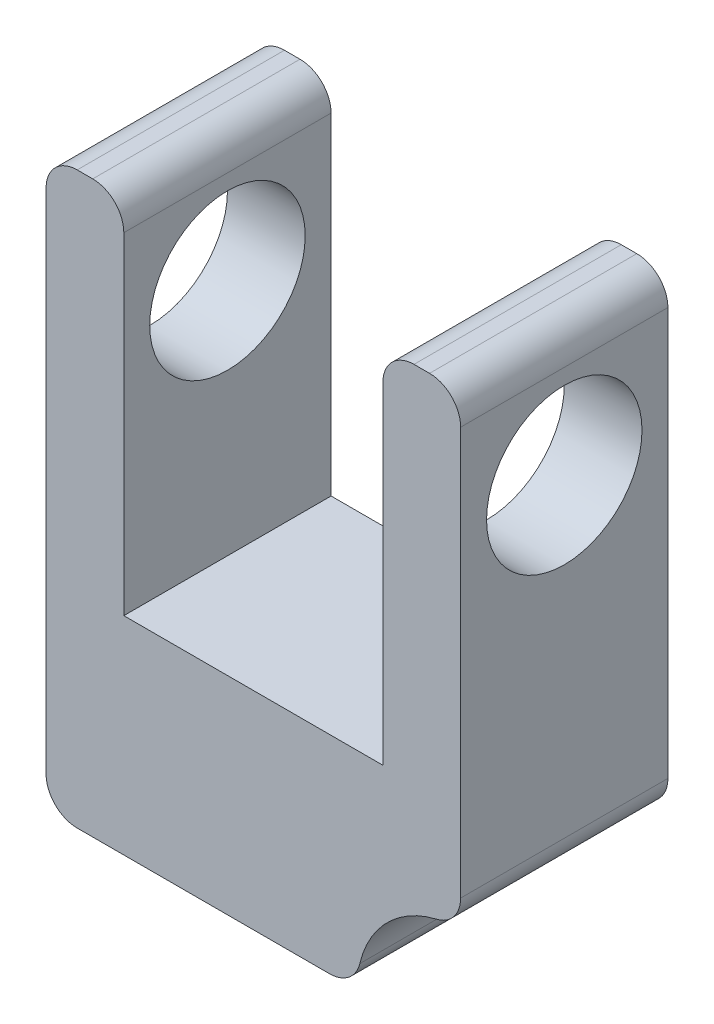
ISO-10303-21;
HEADER;
FILE_DESCRIPTION(('STEP AP214'),'2;1');
FILE_NAME('part.step','',(''),(''),'','','');
FILE_SCHEMA(('AUTOMOTIVE_DESIGN { 1 0 10303 214 1 1 1 1 }'));
ENDSEC;
DATA;
#1=APPLICATION_CONTEXT('core data for automotive mechanical design processes');
#2=APPLICATION_PROTOCOL_DEFINITION('international standard','automotive_design',2000,#1);
#3=PRODUCT_CONTEXT('',#1,'mechanical');
#4=PRODUCT('Part','Part','',(#3));
#5=PRODUCT_RELATED_PRODUCT_CATEGORY('part','',(#4));
#6=PRODUCT_DEFINITION_FORMATION('','',#4);
#7=PRODUCT_DEFINITION_CONTEXT('part definition',#1,'design');
#8=PRODUCT_DEFINITION('design','',#6,#7);
#9=PRODUCT_DEFINITION_SHAPE('','',#8);
#10=(LENGTH_UNIT() NAMED_UNIT(*) SI_UNIT(.MILLI.,.METRE.));
#11=(NAMED_UNIT(*) PLANE_ANGLE_UNIT() SI_UNIT($,.RADIAN.));
#12=(NAMED_UNIT(*) SI_UNIT($,.STERADIAN.) SOLID_ANGLE_UNIT());
#13=UNCERTAINTY_MEASURE_WITH_UNIT(LENGTH_MEASURE(1.E-05),#10,'distance_accuracy_value','');
#14=(GEOMETRIC_REPRESENTATION_CONTEXT(3) GLOBAL_UNCERTAINTY_ASSIGNED_CONTEXT((#13)) GLOBAL_UNIT_ASSIGNED_CONTEXT((#10,
#11,#12)) REPRESENTATION_CONTEXT('',''));
#15=CARTESIAN_POINT('',(0.,0.,0.));
#16=DIRECTION('',(0.,0.,1.));
#17=DIRECTION('',(1.,0.,0.));
#18=AXIS2_PLACEMENT_3D('',#15,#16,#17);
#19=CARTESIAN_POINT('',(0.,55.,0.));
#20=DIRECTION('',(0.,1.,0.));
#21=DIRECTION('',(0.,0.,1.));
#22=AXIS2_PLACEMENT_3D('',#19,#20,#21);
#23=PLANE('',#22);
#24=DIRECTION('',(-1.,0.,0.));
#25=VECTOR('',#24,1.);
#26=CARTESIAN_POINT('',(20.,55.,-10.));
#27=LINE('',#26,#25);
#28=CARTESIAN_POINT('',(-15.5,55.,-10.));
#29=VERTEX_POINT('',#28);
#30=CARTESIAN_POINT('',(-17.,55.,-10.));
#31=VERTEX_POINT('',#30);
#32=EDGE_CURVE('E202',#29,#31,#27,.T.);
#33=ORIENTED_EDGE('',*,*,#32,.T.);
#34=DIRECTION('',(0.,0.,1.));
#35=VECTOR('',#34,1.);
#36=CARTESIAN_POINT('',(-17.,55.,10.));
#37=LINE('',#36,#35);
#38=CARTESIAN_POINT('',(-17.,55.,10.));
#39=VERTEX_POINT('',#38);
#40=EDGE_CURVE('E266',#31,#39,#37,.T.);
#41=ORIENTED_EDGE('',*,*,#40,.T.);
#42=DIRECTION('',(1.,0.,0.));
#43=VECTOR('',#42,1.);
#44=CARTESIAN_POINT('',(20.,55.,10.));
#45=LINE('',#44,#43);
#46=CARTESIAN_POINT('',(-15.5,55.,10.));
#47=VERTEX_POINT('',#46);
#48=EDGE_CURVE('E199',#39,#47,#45,.T.);
#49=ORIENTED_EDGE('',*,*,#48,.T.);
#50=DIRECTION('',(0.,0.,1.));
#51=VECTOR('',#50,1.);
#52=CARTESIAN_POINT('',(-15.5,55.,-10.));
#53=LINE('',#52,#51);
#54=EDGE_CURVE('E264',#47,#29,#53,.F.);
#55=ORIENTED_EDGE('',*,*,#54,.T.);
#56=EDGE_LOOP('',(#33,#41,#49,#55));
#57=FACE_BOUND('',#56,.T.);
#58=ADVANCED_FACE('F39',(#57),#23,.T.);
#59=CARTESIAN_POINT('',(-20.,43.,0.));
#60=DIRECTION('',(1.,0.,0.));
#61=DIRECTION('',(0.,0.,-1.));
#62=AXIS2_PLACEMENT_3D('',#59,#60,#61);
#63=CYLINDRICAL_SURFACE('',#62,7.49999999999999);
#64=CARTESIAN_POINT('',(-12.5,43.,0.));
#65=DIRECTION('',(-1.,0.,0.));
#66=DIRECTION('',(0.,0.,1.));
#67=AXIS2_PLACEMENT_3D('',#64,#65,#66);
#68=CIRCLE('',#67,7.49999999999999);
#69=CARTESIAN_POINT('',(-12.5,43.,7.49999999999999));
#70=VERTEX_POINT('',#69);
#71=EDGE_CURVE('E198',#70,#70,#68,.F.);
#72=ORIENTED_EDGE('',*,*,#71,.T.);
#73=EDGE_LOOP('',(#72));
#74=FACE_BOUND('',#73,.T.);
#75=CARTESIAN_POINT('',(-20.,43.,0.));
#76=DIRECTION('',(1.,0.,0.));
#77=DIRECTION('',(0.,0.,-1.));
#78=AXIS2_PLACEMENT_3D('',#75,#76,#77);
#79=CIRCLE('',#78,7.49999999999999);
#80=CARTESIAN_POINT('',(-20.,43.,-7.49999999999999));
#81=VERTEX_POINT('',#80);
#82=EDGE_CURVE('E191',#81,#81,#79,.T.);
#83=ORIENTED_EDGE('',*,*,#82,.F.);
#84=EDGE_LOOP('',(#83));
#85=FACE_BOUND('',#84,.T.);
#86=ADVANCED_FACE('F365',(#74,#85),#63,.F.);
#87=CARTESIAN_POINT('',(-20.,55.,10.));
#88=DIRECTION('',(1.,0.,0.));
#89=DIRECTION('',(0.,0.,-1.));
#90=AXIS2_PLACEMENT_3D('',#87,#88,#89);
#91=PLANE('',#90);
#92=ORIENTED_EDGE('',*,*,#82,.T.);
#93=EDGE_LOOP('',(#92));
#94=FACE_BOUND('',#93,.T.);
#95=DIRECTION('',(0.,-1.,0.));
#96=VECTOR('',#95,1.);
#97=CARTESIAN_POINT('',(-20.,55.,10.));
#98=LINE('',#97,#96);
#99=CARTESIAN_POINT('',(-20.,52.,10.));
#100=VERTEX_POINT('',#99);
#101=CARTESIAN_POINT('',(-20.,3.,10.));
#102=VERTEX_POINT('',#101);
#103=EDGE_CURVE('E221',#100,#102,#98,.T.);
#104=ORIENTED_EDGE('',*,*,#103,.F.);
#105=DIRECTION('',(0.,0.,1.));
#106=VECTOR('',#105,1.);
#107=CARTESIAN_POINT('',(-20.,52.,-10.));
#108=LINE('',#107,#106);
#109=CARTESIAN_POINT('',(-20.,52.,-10.));
#110=VERTEX_POINT('',#109);
#111=EDGE_CURVE('E271',#100,#110,#108,.F.);
#112=ORIENTED_EDGE('',*,*,#111,.T.);
#113=DIRECTION('',(0.,-1.,0.));
#114=VECTOR('',#113,1.);
#115=CARTESIAN_POINT('',(-20.,55.,-10.));
#116=LINE('',#115,#114);
#117=CARTESIAN_POINT('',(-20.,3.,-10.));
#118=VERTEX_POINT('',#117);
#119=EDGE_CURVE('E212',#110,#118,#116,.T.);
#120=ORIENTED_EDGE('',*,*,#119,.T.);
#121=DIRECTION('',(0.,0.,1.));
#122=VECTOR('',#121,1.);
#123=CARTESIAN_POINT('',(-20.,3.,10.));
#124=LINE('',#123,#122);
#125=EDGE_CURVE('E269',#118,#102,#124,.T.);
#126=ORIENTED_EDGE('',*,*,#125,.T.);
#127=EDGE_LOOP('',(#104,#112,#120,#126));
#128=FACE_BOUND('',#127,.T.);
#129=ADVANCED_FACE('F346',(#94,#128),#91,.F.);
#130=CARTESIAN_POINT('',(20.,55.,10.));
#131=DIRECTION('',(0.,0.,-1.));
#132=DIRECTION('',(-1.,0.,0.));
#133=AXIS2_PLACEMENT_3D('',#130,#131,#132);
#134=PLANE('',#133);
#135=DIRECTION('',(0.,-1.,0.));
#136=VECTOR('',#135,1.);
#137=CARTESIAN_POINT('',(20.,55.,10.));
#138=LINE('',#137,#136);
#139=CARTESIAN_POINT('',(20.,52.,10.));
#140=VERTEX_POINT('',#139);
#141=CARTESIAN_POINT('',(20.,12.6491106406735,10.));
#142=VERTEX_POINT('',#141);
#143=EDGE_CURVE('E218',#140,#142,#138,.T.);
#144=ORIENTED_EDGE('',*,*,#143,.F.);
#145=CARTESIAN_POINT('',(17.,52.,10.));
#146=DIRECTION('',(0.,0.,-1.));
#147=DIRECTION('',(-1.,0.,0.));
#148=AXIS2_PLACEMENT_3D('',#145,#146,#147);
#149=CIRCLE('',#148,3.);
#150=CARTESIAN_POINT('',(17.,55.,10.));
#151=VERTEX_POINT('',#150);
#152=EDGE_CURVE('E262',#140,#151,#149,.F.);
#153=ORIENTED_EDGE('',*,*,#152,.T.);
#154=CARTESIAN_POINT('',(15.5,55.,10.));
#155=VERTEX_POINT('',#154);
#156=EDGE_CURVE('E203',#155,#151,#45,.T.);
#157=ORIENTED_EDGE('',*,*,#156,.F.);
#158=CARTESIAN_POINT('',(15.5,52.,10.));
#159=DIRECTION('',(0.,0.,-1.));
#160=DIRECTION('',(-1.,0.,0.));
#161=AXIS2_PLACEMENT_3D('',#158,#159,#160);
#162=CIRCLE('',#161,3.);
#163=CARTESIAN_POINT('',(12.5,52.,10.));
#164=VERTEX_POINT('',#163);
#165=EDGE_CURVE('E180',#155,#164,#162,.F.);
#166=ORIENTED_EDGE('',*,*,#165,.T.);
#167=DIRECTION('',(0.,1.,0.));
#168=VECTOR('',#167,1.);
#169=CARTESIAN_POINT('',(12.5,55.,10.));
#170=LINE('',#169,#168);
#171=CARTESIAN_POINT('',(12.5,20.,10.));
#172=VERTEX_POINT('',#171);
#173=EDGE_CURVE('E159',#172,#164,#170,.T.);
#174=ORIENTED_EDGE('',*,*,#173,.F.);
#175=DIRECTION('',(1.,0.,0.));
#176=VECTOR('',#175,1.);
#177=CARTESIAN_POINT('',(-12.5,20.,10.));
#178=LINE('',#177,#176);
#179=CARTESIAN_POINT('',(-12.5,20.,10.));
#180=VERTEX_POINT('',#179);
#181=EDGE_CURVE('E171',#180,#172,#178,.T.);
#182=ORIENTED_EDGE('',*,*,#181,.F.);
#183=DIRECTION('',(0.,-1.,0.));
#184=VECTOR('',#183,1.);
#185=CARTESIAN_POINT('',(-12.5,55.,10.));
#186=LINE('',#185,#184);
#187=CARTESIAN_POINT('',(-12.5,52.,10.));
#188=VERTEX_POINT('',#187);
#189=EDGE_CURVE('E175',#188,#180,#186,.T.);
#190=ORIENTED_EDGE('',*,*,#189,.F.);
#191=CARTESIAN_POINT('',(-15.5,52.,10.));
#192=DIRECTION('',(0.,0.,-1.));
#193=DIRECTION('',(-1.,0.,0.));
#194=AXIS2_PLACEMENT_3D('',#191,#192,#193);
#195=CIRCLE('',#194,3.);
#196=EDGE_CURVE('E253',#188,#47,#195,.F.);
#197=ORIENTED_EDGE('',*,*,#196,.T.);
#198=ORIENTED_EDGE('',*,*,#48,.F.);
#199=CARTESIAN_POINT('',(-17.,52.,10.));
#200=DIRECTION('',(0.,0.,-1.));
#201=DIRECTION('',(-1.,0.,0.));
#202=AXIS2_PLACEMENT_3D('',#199,#200,#201);
#203=CIRCLE('',#202,3.);
#204=EDGE_CURVE('E62',#39,#100,#203,.F.);
#205=ORIENTED_EDGE('',*,*,#204,.T.);
#206=ORIENTED_EDGE('',*,*,#103,.T.);
#207=CARTESIAN_POINT('',(-17.,3.,10.));
#208=DIRECTION('',(0.,0.,-1.));
#209=DIRECTION('',(-1.,0.,0.));
#210=AXIS2_PLACEMENT_3D('',#207,#208,#209);
#211=CIRCLE('',#210,3.);
#212=CARTESIAN_POINT('',(-17.,0.,10.));
#213=VERTEX_POINT('',#212);
#214=EDGE_CURVE('E54',#102,#213,#211,.F.);
#215=ORIENTED_EDGE('',*,*,#214,.T.);
#216=DIRECTION('',(1.,0.,0.));
#217=VECTOR('',#216,1.);
#218=CARTESIAN_POINT('',(20.,0.,10.));
#219=LINE('',#218,#217);
#220=CARTESIAN_POINT('',(7.35088935932649,0.,10.));
#221=VERTEX_POINT('',#220);
#222=EDGE_CURVE('E194',#213,#221,#219,.T.);
#223=ORIENTED_EDGE('',*,*,#222,.T.);
#224=CARTESIAN_POINT('',(7.35088935932649,3.,10.));
#225=DIRECTION('',(0.,0.,-1.));
#226=DIRECTION('',(-1.,0.,0.));
#227=AXIS2_PLACEMENT_3D('',#224,#225,#226);
#228=CIRCLE('',#227,3.);
#229=CARTESIAN_POINT('',(10.2699148917896,2.30769230769231,10.));
#230=VERTEX_POINT('',#229);
#231=EDGE_CURVE('E259',#221,#230,#228,.F.);
#232=ORIENTED_EDGE('',*,*,#231,.T.);
#233=CARTESIAN_POINT('',(20.,0.,10.));
#234=DIRECTION('',(0.,0.,1.));
#235=DIRECTION('',(1.,0.,0.));
#236=AXIS2_PLACEMENT_3D('',#233,#234,#235);
#237=CIRCLE('',#236,9.99999999999999);
#238=CARTESIAN_POINT('',(17.6923076923077,9.73008510821039,10.));
#239=VERTEX_POINT('',#238);
#240=EDGE_CURVE('E188',#239,#230,#237,.T.);
#241=ORIENTED_EDGE('',*,*,#240,.F.);
#242=CARTESIAN_POINT('',(17.,12.6491106406735,10.));
#243=DIRECTION('',(0.,0.,-1.));
#244=DIRECTION('',(-1.,0.,0.));
#245=AXIS2_PLACEMENT_3D('',#242,#243,#244);
#246=CIRCLE('',#245,3.);
#247=EDGE_CURVE('E257',#239,#142,#246,.F.);
#248=ORIENTED_EDGE('',*,*,#247,.T.);
#249=EDGE_LOOP('',(#144,#153,#157,#166,#174,#182,#190,#197,#198,#205,#206,#215,#223,#232,#241,#248));
#250=FACE_BOUND('',#249,.T.);
#251=ADVANCED_FACE('F178',(#250),#134,.F.);
#252=CARTESIAN_POINT('',(20.,55.,10.));
#253=DIRECTION('',(-1.,0.,0.));
#254=DIRECTION('',(0.,0.,1.));
#255=AXIS2_PLACEMENT_3D('',#252,#253,#254);
#256=PLANE('',#255);
#257=CARTESIAN_POINT('',(20.,43.,0.));
#258=DIRECTION('',(1.,0.,0.));
#259=DIRECTION('',(0.,0.,-1.));
#260=AXIS2_PLACEMENT_3D('',#257,#258,#259);
#261=CIRCLE('',#260,7.49999999999999);
#262=CARTESIAN_POINT('',(20.,43.,-7.49999999999999));
#263=VERTEX_POINT('',#262);
#264=EDGE_CURVE('E195',#263,#263,#261,.T.);
#265=ORIENTED_EDGE('',*,*,#264,.F.);
#266=EDGE_LOOP('',(#265));
#267=FACE_BOUND('',#266,.T.);
#268=DIRECTION('',(0.,-1.,0.));
#269=VECTOR('',#268,1.);
#270=CARTESIAN_POINT('',(20.,55.,-10.));
#271=LINE('',#270,#269);
#272=CARTESIAN_POINT('',(20.,52.,-10.));
#273=VERTEX_POINT('',#272);
#274=CARTESIAN_POINT('',(20.,12.6491106406735,-10.));
#275=VERTEX_POINT('',#274);
#276=EDGE_CURVE('E215',#273,#275,#271,.T.);
#277=ORIENTED_EDGE('',*,*,#276,.F.);
#278=DIRECTION('',(0.,0.,-1.));
#279=VECTOR('',#278,1.);
#280=CARTESIAN_POINT('',(20.,52.,10.));
#281=LINE('',#280,#279);
#282=EDGE_CURVE('E251',#273,#140,#281,.F.);
#283=ORIENTED_EDGE('',*,*,#282,.T.);
#284=ORIENTED_EDGE('',*,*,#143,.T.);
#285=DIRECTION('',(0.,0.,1.));
#286=VECTOR('',#285,1.);
#287=CARTESIAN_POINT('',(20.,12.6491106406735,10.));
#288=LINE('',#287,#286);
#289=EDGE_CURVE('E249',#142,#275,#288,.F.);
#290=ORIENTED_EDGE('',*,*,#289,.T.);
#291=EDGE_LOOP('',(#277,#283,#284,#290));
#292=FACE_BOUND('',#291,.T.);
#293=ADVANCED_FACE('F301',(#267,#292),#256,.F.);
#294=CARTESIAN_POINT('',(20.,55.,-10.));
#295=DIRECTION('',(0.,0.,1.));
#296=DIRECTION('',(1.,0.,0.));
#297=AXIS2_PLACEMENT_3D('',#294,#295,#296);
#298=PLANE('',#297);
#299=CARTESIAN_POINT('',(17.,55.,-10.));
#300=VERTEX_POINT('',#299);
#301=CARTESIAN_POINT('',(15.5,55.,-10.));
#302=VERTEX_POINT('',#301);
#303=EDGE_CURVE('E206',#300,#302,#27,.T.);
#304=ORIENTED_EDGE('',*,*,#303,.F.);
#305=CARTESIAN_POINT('',(17.,52.,-10.));
#306=DIRECTION('',(0.,0.,1.));
#307=DIRECTION('',(1.,0.,0.));
#308=AXIS2_PLACEMENT_3D('',#305,#306,#307);
#309=CIRCLE('',#308,3.);
#310=EDGE_CURVE('E247',#300,#273,#309,.F.);
#311=ORIENTED_EDGE('',*,*,#310,.T.);
#312=ORIENTED_EDGE('',*,*,#276,.T.);
#313=CARTESIAN_POINT('',(17.,12.6491106406735,-10.));
#314=DIRECTION('',(0.,0.,1.));
#315=DIRECTION('',(1.,0.,0.));
#316=AXIS2_PLACEMENT_3D('',#313,#314,#315);
#317=CIRCLE('',#316,3.);
#318=CARTESIAN_POINT('',(17.6923076923077,9.73008510821039,-10.));
#319=VERTEX_POINT('',#318);
#320=EDGE_CURVE('E241',#275,#319,#317,.F.);
#321=ORIENTED_EDGE('',*,*,#320,.T.);
#322=CARTESIAN_POINT('',(20.,0.,-10.));
#323=DIRECTION('',(0.,0.,1.));
#324=DIRECTION('',(1.,0.,0.));
#325=AXIS2_PLACEMENT_3D('',#322,#323,#324);
#326=CIRCLE('',#325,9.99999999999999);
#327=CARTESIAN_POINT('',(10.2699148917896,2.30769230769231,-10.));
#328=VERTEX_POINT('',#327);
#329=EDGE_CURVE('E227',#319,#328,#326,.T.);
#330=ORIENTED_EDGE('',*,*,#329,.T.);
#331=CARTESIAN_POINT('',(7.35088935932649,3.,-10.));
#332=DIRECTION('',(0.,0.,1.));
#333=DIRECTION('',(1.,0.,0.));
#334=AXIS2_PLACEMENT_3D('',#331,#332,#333);
#335=CIRCLE('',#334,3.);
#336=CARTESIAN_POINT('',(7.35088935932649,0.,-10.));
#337=VERTEX_POINT('',#336);
#338=EDGE_CURVE('E243',#328,#337,#335,.F.);
#339=ORIENTED_EDGE('',*,*,#338,.T.);
#340=DIRECTION('',(-1.,0.,0.));
#341=VECTOR('',#340,1.);
#342=CARTESIAN_POINT('',(20.,0.,-10.));
#343=LINE('',#342,#341);
#344=CARTESIAN_POINT('',(-17.,0.,-10.));
#345=VERTEX_POINT('',#344);
#346=EDGE_CURVE('E209',#337,#345,#343,.T.);
#347=ORIENTED_EDGE('',*,*,#346,.T.);
#348=CARTESIAN_POINT('',(-17.,3.,-10.));
#349=DIRECTION('',(0.,0.,1.));
#350=DIRECTION('',(1.,0.,0.));
#351=AXIS2_PLACEMENT_3D('',#348,#349,#350);
#352=CIRCLE('',#351,3.);
#353=EDGE_CURVE('E239',#345,#118,#352,.F.);
#354=ORIENTED_EDGE('',*,*,#353,.T.);
#355=ORIENTED_EDGE('',*,*,#119,.F.);
#356=CARTESIAN_POINT('',(-17.,52.,-10.));
#357=DIRECTION('',(0.,0.,1.));
#358=DIRECTION('',(1.,0.,0.));
#359=AXIS2_PLACEMENT_3D('',#356,#357,#358);
#360=CIRCLE('',#359,3.);
#361=EDGE_CURVE('E245',#110,#31,#360,.F.);
#362=ORIENTED_EDGE('',*,*,#361,.T.);
#363=ORIENTED_EDGE('',*,*,#32,.F.);
#364=CARTESIAN_POINT('',(-15.5,52.,-10.));
#365=DIRECTION('',(0.,0.,1.));
#366=DIRECTION('',(1.,0.,0.));
#367=AXIS2_PLACEMENT_3D('',#364,#365,#366);
#368=CIRCLE('',#367,3.);
#369=CARTESIAN_POINT('',(-12.5,52.,-10.));
#370=VERTEX_POINT('',#369);
#371=EDGE_CURVE('E235',#29,#370,#368,.F.);
#372=ORIENTED_EDGE('',*,*,#371,.T.);
#373=DIRECTION('',(0.,-1.,0.));
#374=VECTOR('',#373,1.);
#375=CARTESIAN_POINT('',(-12.5,55.,-10.));
#376=LINE('',#375,#374);
#377=CARTESIAN_POINT('',(-12.5,20.,-10.));
#378=VERTEX_POINT('',#377);
#379=EDGE_CURVE('E181',#370,#378,#376,.T.);
#380=ORIENTED_EDGE('',*,*,#379,.T.);
#381=DIRECTION('',(1.,0.,0.));
#382=VECTOR('',#381,1.);
#383=CARTESIAN_POINT('',(-12.5,20.,-10.));
#384=LINE('',#383,#382);
#385=CARTESIAN_POINT('',(12.5,20.,-10.));
#386=VERTEX_POINT('',#385);
#387=EDGE_CURVE('E183',#378,#386,#384,.T.);
#388=ORIENTED_EDGE('',*,*,#387,.T.);
#389=DIRECTION('',(0.,1.,0.));
#390=VECTOR('',#389,1.);
#391=CARTESIAN_POINT('',(12.5,55.,-10.));
#392=LINE('',#391,#390);
#393=CARTESIAN_POINT('',(12.5,52.,-10.));
#394=VERTEX_POINT('',#393);
#395=EDGE_CURVE('E162',#386,#394,#392,.T.);
#396=ORIENTED_EDGE('',*,*,#395,.T.);
#397=CARTESIAN_POINT('',(15.5,52.,-10.));
#398=DIRECTION('',(0.,0.,1.));
#399=DIRECTION('',(1.,0.,0.));
#400=AXIS2_PLACEMENT_3D('',#397,#398,#399);
#401=CIRCLE('',#400,3.);
#402=EDGE_CURVE('E237',#394,#302,#401,.F.);
#403=ORIENTED_EDGE('',*,*,#402,.T.);
#404=EDGE_LOOP('',(#304,#311,#312,#321,#330,#339,#347,#354,#355,#362,#363,#372,#380,#388,#396,#403));
#405=FACE_BOUND('',#404,.T.);
#406=ADVANCED_FACE('F286',(#405),#298,.F.);
#407=ORIENTED_EDGE('',*,*,#156,.T.);
#408=DIRECTION('',(0.,0.,-1.));
#409=VECTOR('',#408,1.);
#410=CARTESIAN_POINT('',(17.,55.,-10.));
#411=LINE('',#410,#409);
#412=EDGE_CURVE('E232',#151,#300,#411,.T.);
#413=ORIENTED_EDGE('',*,*,#412,.T.);
#414=ORIENTED_EDGE('',*,*,#303,.T.);
#415=DIRECTION('',(0.,0.,1.));
#416=VECTOR('',#415,1.);
#417=CARTESIAN_POINT('',(15.5,55.,10.));
#418=LINE('',#417,#416);
#419=EDGE_CURVE('E223',#302,#155,#418,.T.);
#420=ORIENTED_EDGE('',*,*,#419,.T.);
#421=EDGE_LOOP('',(#407,#413,#414,#420));
#422=FACE_BOUND('',#421,.T.);
#423=ADVANCED_FACE('F292',(#422),#23,.T.);
#424=CARTESIAN_POINT('',(0.,0.,0.));
#425=DIRECTION('',(0.,1.,0.));
#426=DIRECTION('',(0.,0.,1.));
#427=AXIS2_PLACEMENT_3D('',#424,#425,#426);
#428=PLANE('',#427);
#429=CARTESIAN_POINT('',(-4.82455532033676,0.,0.));
#430=DIRECTION('',(0.,-1.,0.));
#431=DIRECTION('',(0.,0.,-1.));
#432=AXIS2_PLACEMENT_3D('',#429,#430,#431);
#433=CIRCLE('',#432,5.);
#434=CARTESIAN_POINT('',(-4.82455532033676,0.,-5.));
#435=VERTEX_POINT('',#434);
#436=EDGE_CURVE('E317',#435,#435,#433,.T.);
#437=ORIENTED_EDGE('',*,*,#436,.F.);
#438=EDGE_LOOP('',(#437));
#439=FACE_BOUND('',#438,.T.);
#440=ORIENTED_EDGE('',*,*,#346,.F.);
#441=DIRECTION('',(0.,0.,1.));
#442=VECTOR('',#441,1.);
#443=CARTESIAN_POINT('',(7.35088935932649,0.,0.));
#444=LINE('',#443,#442);
#445=EDGE_CURVE('E275',#337,#221,#444,.T.);
#446=ORIENTED_EDGE('',*,*,#445,.T.);
#447=ORIENTED_EDGE('',*,*,#222,.F.);
#448=DIRECTION('',(0.,0.,1.));
#449=VECTOR('',#448,1.);
#450=CARTESIAN_POINT('',(-17.,0.,0.));
#451=LINE('',#450,#449);
#452=EDGE_CURVE('E273',#213,#345,#451,.F.);
#453=ORIENTED_EDGE('',*,*,#452,.T.);
#454=EDGE_LOOP('',(#440,#446,#447,#453));
#455=FACE_BOUND('',#454,.T.);
#456=ADVANCED_FACE('F331',(#439,#455),#428,.F.);
#457=CARTESIAN_POINT('',(12.5,43.,0.));
#458=DIRECTION('',(1.,0.,0.));
#459=DIRECTION('',(0.,0.,-1.));
#460=AXIS2_PLACEMENT_3D('',#457,#458,#459);
#461=CIRCLE('',#460,7.49999999999999);
#462=CARTESIAN_POINT('',(12.5,43.,-7.49999999999999));
#463=VERTEX_POINT('',#462);
#464=EDGE_CURVE('E224',#463,#463,#461,.F.);
#465=ORIENTED_EDGE('',*,*,#464,.T.);
#466=EDGE_LOOP('',(#465));
#467=FACE_BOUND('',#466,.T.);
#468=ORIENTED_EDGE('',*,*,#264,.T.);
#469=EDGE_LOOP('',(#468));
#470=FACE_BOUND('',#469,.T.);
#471=ADVANCED_FACE('F334',(#467,#470),#63,.F.);
#472=CARTESIAN_POINT('',(-12.5,55.,-10.));
#473=DIRECTION('',(-1.,0.,0.));
#474=DIRECTION('',(0.,0.,1.));
#475=AXIS2_PLACEMENT_3D('',#472,#473,#474);
#476=PLANE('',#475);
#477=ORIENTED_EDGE('',*,*,#379,.F.);
#478=DIRECTION('',(0.,0.,1.));
#479=VECTOR('',#478,1.);
#480=CARTESIAN_POINT('',(-12.5,52.,10.));
#481=LINE('',#480,#479);
#482=EDGE_CURVE('E11',#370,#188,#481,.T.);
#483=ORIENTED_EDGE('',*,*,#482,.T.);
#484=ORIENTED_EDGE('',*,*,#189,.T.);
#485=DIRECTION('',(0.,0.,1.));
#486=VECTOR('',#485,1.);
#487=CARTESIAN_POINT('',(-12.5,20.,-10.));
#488=LINE('',#487,#486);
#489=EDGE_CURVE('E166',#378,#180,#488,.T.);
#490=ORIENTED_EDGE('',*,*,#489,.F.);
#491=EDGE_LOOP('',(#477,#483,#484,#490));
#492=FACE_BOUND('',#491,.T.);
#493=ORIENTED_EDGE('',*,*,#71,.F.);
#494=EDGE_LOOP('',(#493));
#495=FACE_BOUND('',#494,.T.);
#496=ADVANCED_FACE('F359',(#492,#495),#476,.F.);
#497=CARTESIAN_POINT('',(12.5,55.,-10.));
#498=DIRECTION('',(1.,0.,0.));
#499=DIRECTION('',(0.,0.,-1.));
#500=AXIS2_PLACEMENT_3D('',#497,#498,#499);
#501=PLANE('',#500);
#502=ORIENTED_EDGE('',*,*,#173,.T.);
#503=DIRECTION('',(0.,0.,1.));
#504=VECTOR('',#503,1.);
#505=CARTESIAN_POINT('',(12.5,52.,-10.));
#506=LINE('',#505,#504);
#507=EDGE_CURVE('E47',#164,#394,#506,.F.);
#508=ORIENTED_EDGE('',*,*,#507,.T.);
#509=ORIENTED_EDGE('',*,*,#395,.F.);
#510=DIRECTION('',(0.,0.,1.));
#511=VECTOR('',#510,1.);
#512=CARTESIAN_POINT('',(12.5,20.,-10.));
#513=LINE('',#512,#511);
#514=EDGE_CURVE('E154',#386,#172,#513,.T.);
#515=ORIENTED_EDGE('',*,*,#514,.T.);
#516=EDGE_LOOP('',(#502,#508,#509,#515));
#517=FACE_BOUND('',#516,.T.);
#518=ORIENTED_EDGE('',*,*,#464,.F.);
#519=EDGE_LOOP('',(#518));
#520=FACE_BOUND('',#519,.T.);
#521=ADVANCED_FACE('F156',(#517,#520),#501,.F.);
#522=CARTESIAN_POINT('',(-12.5,20.,-10.));
#523=DIRECTION('',(0.,-1.,0.));
#524=DIRECTION('',(1.,0.,0.));
#525=AXIS2_PLACEMENT_3D('',#522,#523,#524);
#526=PLANE('',#525);
#527=ORIENTED_EDGE('',*,*,#181,.T.);
#528=ORIENTED_EDGE('',*,*,#514,.F.);
#529=ORIENTED_EDGE('',*,*,#387,.F.);
#530=ORIENTED_EDGE('',*,*,#489,.T.);
#531=EDGE_LOOP('',(#527,#528,#529,#530));
#532=FACE_BOUND('',#531,.T.);
#533=ADVANCED_FACE('F172',(#532),#526,.F.);
#534=CARTESIAN_POINT('',(20.,0.,-10.));
#535=DIRECTION('',(0.,0.,1.));
#536=DIRECTION('',(1.,0.,0.));
#537=AXIS2_PLACEMENT_3D('',#534,#535,#536);
#538=CYLINDRICAL_SURFACE('',#537,9.99999999999999);
#539=ORIENTED_EDGE('',*,*,#240,.T.);
#540=DIRECTION('',(0.,0.,1.));
#541=VECTOR('',#540,1.);
#542=CARTESIAN_POINT('',(10.2699148917896,2.30769230769231,-10.));
#543=LINE('',#542,#541);
#544=EDGE_CURVE('E281',#230,#328,#543,.F.);
#545=ORIENTED_EDGE('',*,*,#544,.T.);
#546=ORIENTED_EDGE('',*,*,#329,.F.);
#547=DIRECTION('',(0.,0.,1.));
#548=VECTOR('',#547,1.);
#549=CARTESIAN_POINT('',(17.6923076923077,9.73008510821039,-10.));
#550=LINE('',#549,#548);
#551=EDGE_CURVE('E278',#319,#239,#550,.T.);
#552=ORIENTED_EDGE('',*,*,#551,.T.);
#553=EDGE_LOOP('',(#539,#545,#546,#552));
#554=FACE_BOUND('',#553,.T.);
#555=ADVANCED_FACE('F311',(#554),#538,.F.);
#556=CARTESIAN_POINT('',(17.,52.,0.));
#557=DIRECTION('',(0.,0.,1.));
#558=DIRECTION('',(1.,0.,0.));
#559=AXIS2_PLACEMENT_3D('',#556,#557,#558);
#560=CYLINDRICAL_SURFACE('',#559,3.);
#561=ORIENTED_EDGE('',*,*,#152,.F.);
#562=ORIENTED_EDGE('',*,*,#282,.F.);
#563=ORIENTED_EDGE('',*,*,#310,.F.);
#564=ORIENTED_EDGE('',*,*,#412,.F.);
#565=EDGE_LOOP('',(#561,#562,#563,#564));
#566=FACE_BOUND('',#565,.T.);
#567=ADVANCED_FACE('F297',(#566),#560,.T.);
#568=CARTESIAN_POINT('',(-17.,52.,0.));
#569=DIRECTION('',(0.,0.,-1.));
#570=DIRECTION('',(-1.,0.,0.));
#571=AXIS2_PLACEMENT_3D('',#568,#569,#570);
#572=CYLINDRICAL_SURFACE('',#571,3.);
#573=ORIENTED_EDGE('',*,*,#361,.F.);
#574=ORIENTED_EDGE('',*,*,#111,.F.);
#575=ORIENTED_EDGE('',*,*,#204,.F.);
#576=ORIENTED_EDGE('',*,*,#40,.F.);
#577=EDGE_LOOP('',(#573,#574,#575,#576));
#578=FACE_BOUND('',#577,.T.);
#579=ADVANCED_FACE('F349',(#578),#572,.T.);
#580=CARTESIAN_POINT('',(7.35088935932649,3.,-10.));
#581=DIRECTION('',(0.,0.,1.));
#582=DIRECTION('',(1.,0.,0.));
#583=AXIS2_PLACEMENT_3D('',#580,#581,#582);
#584=CYLINDRICAL_SURFACE('',#583,3.);
#585=ORIENTED_EDGE('',*,*,#338,.F.);
#586=ORIENTED_EDGE('',*,*,#544,.F.);
#587=ORIENTED_EDGE('',*,*,#231,.F.);
#588=ORIENTED_EDGE('',*,*,#445,.F.);
#589=EDGE_LOOP('',(#585,#586,#587,#588));
#590=FACE_BOUND('',#589,.T.);
#591=ADVANCED_FACE('F341',(#590),#584,.T.);
#592=CARTESIAN_POINT('',(17.,12.6491106406735,-10.));
#593=DIRECTION('',(0.,0.,1.));
#594=DIRECTION('',(1.,0.,0.));
#595=AXIS2_PLACEMENT_3D('',#592,#593,#594);
#596=CYLINDRICAL_SURFACE('',#595,3.);
#597=ORIENTED_EDGE('',*,*,#320,.F.);
#598=ORIENTED_EDGE('',*,*,#289,.F.);
#599=ORIENTED_EDGE('',*,*,#247,.F.);
#600=ORIENTED_EDGE('',*,*,#551,.F.);
#601=EDGE_LOOP('',(#597,#598,#599,#600));
#602=FACE_BOUND('',#601,.T.);
#603=ADVANCED_FACE('F304',(#602),#596,.T.);
#604=CARTESIAN_POINT('',(-17.,3.,10.));
#605=DIRECTION('',(0.,0.,1.));
#606=DIRECTION('',(1.,0.,0.));
#607=AXIS2_PLACEMENT_3D('',#604,#605,#606);
#608=CYLINDRICAL_SURFACE('',#607,3.);
#609=ORIENTED_EDGE('',*,*,#353,.F.);
#610=ORIENTED_EDGE('',*,*,#452,.F.);
#611=ORIENTED_EDGE('',*,*,#214,.F.);
#612=ORIENTED_EDGE('',*,*,#125,.F.);
#613=EDGE_LOOP('',(#609,#610,#611,#612));
#614=FACE_BOUND('',#613,.T.);
#615=ADVANCED_FACE('F342',(#614),#608,.T.);
#616=CARTESIAN_POINT('',(15.5,52.,0.));
#617=DIRECTION('',(0.,0.,-1.));
#618=DIRECTION('',(-1.,0.,0.));
#619=AXIS2_PLACEMENT_3D('',#616,#617,#618);
#620=CYLINDRICAL_SURFACE('',#619,3.);
#621=ORIENTED_EDGE('',*,*,#402,.F.);
#622=ORIENTED_EDGE('',*,*,#507,.F.);
#623=ORIENTED_EDGE('',*,*,#165,.F.);
#624=ORIENTED_EDGE('',*,*,#419,.F.);
#625=EDGE_LOOP('',(#621,#622,#623,#624));
#626=FACE_BOUND('',#625,.T.);
#627=ADVANCED_FACE('F289',(#626),#620,.T.);
#628=CARTESIAN_POINT('',(-15.5,52.,-10.));
#629=DIRECTION('',(0.,0.,-1.));
#630=DIRECTION('',(-1.,0.,0.));
#631=AXIS2_PLACEMENT_3D('',#628,#629,#630);
#632=CYLINDRICAL_SURFACE('',#631,3.);
#633=ORIENTED_EDGE('',*,*,#371,.F.);
#634=ORIENTED_EDGE('',*,*,#54,.F.);
#635=ORIENTED_EDGE('',*,*,#196,.F.);
#636=ORIENTED_EDGE('',*,*,#482,.F.);
#637=EDGE_LOOP('',(#633,#634,#635,#636));
#638=FACE_BOUND('',#637,.T.);
#639=ADVANCED_FACE('F41',(#638),#632,.T.);
#640=CARTESIAN_POINT('',(-4.82455532033676,10.,0.));
#641=DIRECTION('',(0.,-1.,0.));
#642=DIRECTION('',(0.,0.,-1.));
#643=AXIS2_PLACEMENT_3D('',#640,#641,#642);
#644=CYLINDRICAL_SURFACE('',#643,5.);
#645=CARTESIAN_POINT('',(-4.82455532033676,10.,0.));
#646=DIRECTION('',(0.,-1.,0.));
#647=DIRECTION('',(0.,0.,-1.));
#648=AXIS2_PLACEMENT_3D('',#645,#646,#647);
#649=CIRCLE('',#648,5.);
#650=CARTESIAN_POINT('',(-4.82455532033676,10.,-5.));
#651=VERTEX_POINT('',#650);
#652=EDGE_CURVE('E167',#651,#651,#649,.T.);
#653=ORIENTED_EDGE('',*,*,#652,.F.);
#654=EDGE_LOOP('',(#653));
#655=FACE_BOUND('',#654,.T.);
#656=ORIENTED_EDGE('',*,*,#436,.T.);
#657=EDGE_LOOP('',(#656));
#658=FACE_BOUND('',#657,.T.);
#659=ADVANCED_FACE('F325',(#655,#658),#644,.F.);
#660=CARTESIAN_POINT('',(-4.82455532033676,10.,0.));
#661=DIRECTION('',(0.,-1.,0.));
#662=DIRECTION('',(0.,0.,-1.));
#663=AXIS2_PLACEMENT_3D('',#660,#661,#662);
#664=PLANE('',#663);
#665=ORIENTED_EDGE('',*,*,#652,.T.);
#666=EDGE_LOOP('',(#665));
#667=FACE_BOUND('',#666,.T.);
#668=ADVANCED_FACE('F323',(#667),#664,.T.);
#669=CLOSED_SHELL('',(#58,#86,#129,#251,#293,#406,#423,#456,#471,#496,#521,#533,#555,#567,#579,
#591,#603,#615,#627,#639,#659,#668));
#670=MANIFOLD_SOLID_BREP('B2',#669);
#671=ADVANCED_BREP_SHAPE_REPRESENTATION('',(#18,#670),#14);
#672=SHAPE_DEFINITION_REPRESENTATION(#9,#671);
ENDSEC;
END-ISO-10303-21;
